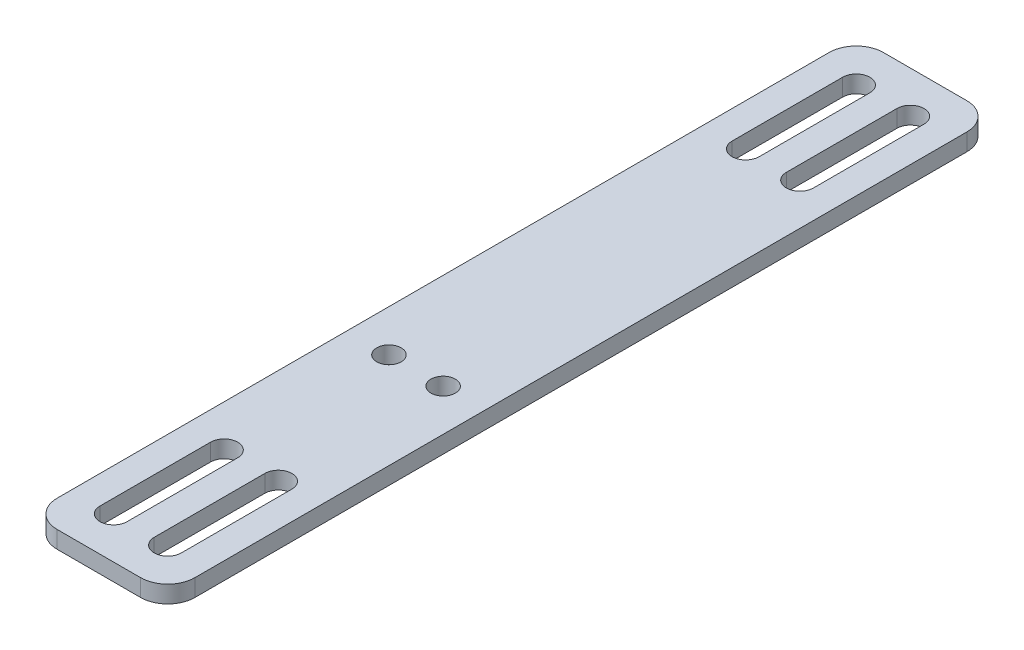
ISO-10303-21;
HEADER;
FILE_DESCRIPTION(('STEP AP214'),'2;1');
FILE_NAME('part.step','',(''),(''),'','','');
FILE_SCHEMA(('AUTOMOTIVE_DESIGN { 1 0 10303 214 1 1 1 1 }'));
ENDSEC;
DATA;
#1=APPLICATION_CONTEXT('core data for automotive mechanical design processes');
#2=APPLICATION_PROTOCOL_DEFINITION('international standard','automotive_design',2000,#1);
#3=PRODUCT_CONTEXT('',#1,'mechanical');
#4=PRODUCT('Part','Part','',(#3));
#5=PRODUCT_RELATED_PRODUCT_CATEGORY('part','',(#4));
#6=PRODUCT_DEFINITION_FORMATION('','',#4);
#7=PRODUCT_DEFINITION_CONTEXT('part definition',#1,'design');
#8=PRODUCT_DEFINITION('design','',#6,#7);
#9=PRODUCT_DEFINITION_SHAPE('','',#8);
#10=(LENGTH_UNIT() NAMED_UNIT(*) SI_UNIT(.MILLI.,.METRE.));
#11=(NAMED_UNIT(*) PLANE_ANGLE_UNIT() SI_UNIT($,.RADIAN.));
#12=(NAMED_UNIT(*) SI_UNIT($,.STERADIAN.) SOLID_ANGLE_UNIT());
#13=UNCERTAINTY_MEASURE_WITH_UNIT(LENGTH_MEASURE(1.E-05),#10,'distance_accuracy_value','');
#14=(GEOMETRIC_REPRESENTATION_CONTEXT(3) GLOBAL_UNCERTAINTY_ASSIGNED_CONTEXT((#13)) GLOBAL_UNIT_ASSIGNED_CONTEXT((#10,
#11,#12)) REPRESENTATION_CONTEXT('',''));
#15=CARTESIAN_POINT('',(0.,0.,0.));
#16=DIRECTION('',(0.,0.,1.));
#17=DIRECTION('',(1.,0.,0.));
#18=AXIS2_PLACEMENT_3D('',#15,#16,#17);
#19=CARTESIAN_POINT('',(12.7,-1.5875,76.2));
#20=DIRECTION('',(0.,1.,0.));
#21=DIRECTION('',(0.,0.,1.));
#22=AXIS2_PLACEMENT_3D('',#19,#20,#21);
#23=PLANE('',#22);
#24=CARTESIAN_POINT('',(5.,-1.5875,17.7));
#25=DIRECTION('',(0.,1.,0.));
#26=DIRECTION('',(0.,0.,1.));
#27=AXIS2_PLACEMENT_3D('',#24,#25,#26);
#28=CIRCLE('',#27,2.25);
#29=CARTESIAN_POINT('',(5.,-1.5875,19.95));
#30=VERTEX_POINT('',#29);
#31=EDGE_CURVE('E562',#30,#30,#28,.T.);
#32=ORIENTED_EDGE('',*,*,#31,.T.);
#33=EDGE_LOOP('',(#32));
#34=FACE_BOUND('',#33,.T.);
#35=CARTESIAN_POINT('',(-5.,-1.5875,17.7));
#36=DIRECTION('',(0.,1.,0.));
#37=DIRECTION('',(0.,0.,1.));
#38=AXIS2_PLACEMENT_3D('',#35,#36,#37);
#39=CIRCLE('',#38,2.25);
#40=CARTESIAN_POINT('',(-5.,-1.5875,19.95));
#41=VERTEX_POINT('',#40);
#42=EDGE_CURVE('E251',#41,#41,#39,.T.);
#43=ORIENTED_EDGE('',*,*,#42,.T.);
#44=EDGE_LOOP('',(#43));
#45=FACE_BOUND('',#44,.T.);
#46=CARTESIAN_POINT('',(-5.,-1.5875,-48.1));
#47=DIRECTION('',(0.,1.,0.));
#48=DIRECTION('',(0.,0.,1.));
#49=AXIS2_PLACEMENT_3D('',#46,#47,#48);
#50=CIRCLE('',#49,2.5);
#51=CARTESIAN_POINT('',(-7.5,-1.5875,-48.1));
#52=VERTEX_POINT('',#51);
#53=CARTESIAN_POINT('',(-2.5,-1.5875,-48.1));
#54=VERTEX_POINT('',#53);
#55=EDGE_CURVE('E247',#52,#54,#50,.T.);
#56=ORIENTED_EDGE('',*,*,#55,.T.);
#57=DIRECTION('',(0.,0.,-1.));
#58=VECTOR('',#57,1.);
#59=CARTESIAN_POINT('',(-2.5,-1.5875,-48.1));
#60=LINE('',#59,#58);
#61=CARTESIAN_POINT('',(-2.5,-1.5875,-68.5));
#62=VERTEX_POINT('',#61);
#63=EDGE_CURVE('E257',#54,#62,#60,.T.);
#64=ORIENTED_EDGE('',*,*,#63,.T.);
#65=CARTESIAN_POINT('',(-5.,-1.5875,-68.5));
#66=DIRECTION('',(0.,1.,0.));
#67=DIRECTION('',(0.,0.,1.));
#68=AXIS2_PLACEMENT_3D('',#65,#66,#67);
#69=CIRCLE('',#68,2.5);
#70=CARTESIAN_POINT('',(-7.50000000000001,-1.5875,-68.5));
#71=VERTEX_POINT('',#70);
#72=EDGE_CURVE('E254',#62,#71,#69,.T.);
#73=ORIENTED_EDGE('',*,*,#72,.T.);
#74=DIRECTION('',(0.,0.,-1.));
#75=VECTOR('',#74,1.);
#76=CARTESIAN_POINT('',(-7.5,-1.5875,-48.1));
#77=LINE('',#76,#75);
#78=EDGE_CURVE('E250',#52,#71,#77,.T.);
#79=ORIENTED_EDGE('',*,*,#78,.F.);
#80=EDGE_LOOP('',(#56,#64,#73,#79));
#81=FACE_BOUND('',#80,.T.);
#82=DIRECTION('',(0.,0.,1.));
#83=VECTOR('',#82,1.);
#84=CARTESIAN_POINT('',(7.5,-1.5875,48.1));
#85=LINE('',#84,#83);
#86=CARTESIAN_POINT('',(7.5,-1.5875,48.1));
#87=VERTEX_POINT('',#86);
#88=CARTESIAN_POINT('',(7.5,-1.5875,68.5));
#89=VERTEX_POINT('',#88);
#90=EDGE_CURVE('E281',#87,#89,#85,.T.);
#91=ORIENTED_EDGE('',*,*,#90,.F.);
#92=CARTESIAN_POINT('',(5.,-1.5875,48.1));
#93=DIRECTION('',(0.,-1.,0.));
#94=DIRECTION('',(0.,0.,-1.));
#95=AXIS2_PLACEMENT_3D('',#92,#93,#94);
#96=CIRCLE('',#95,2.5);
#97=CARTESIAN_POINT('',(2.5,-1.5875,48.1));
#98=VERTEX_POINT('',#97);
#99=EDGE_CURVE('E279',#98,#87,#96,.T.);
#100=ORIENTED_EDGE('',*,*,#99,.F.);
#101=DIRECTION('',(0.,0.,1.));
#102=VECTOR('',#101,1.);
#103=CARTESIAN_POINT('',(2.5,-1.5875,48.1));
#104=LINE('',#103,#102);
#105=CARTESIAN_POINT('',(2.5,-1.5875,68.5));
#106=VERTEX_POINT('',#105);
#107=EDGE_CURVE('E288',#98,#106,#104,.T.);
#108=ORIENTED_EDGE('',*,*,#107,.T.);
#109=CARTESIAN_POINT('',(5.,-1.5875,68.5));
#110=DIRECTION('',(0.,-1.,0.));
#111=DIRECTION('',(0.,0.,-1.));
#112=AXIS2_PLACEMENT_3D('',#109,#110,#111);
#113=CIRCLE('',#112,2.5);
#114=EDGE_CURVE('E285',#89,#106,#113,.T.);
#115=ORIENTED_EDGE('',*,*,#114,.F.);
#116=EDGE_LOOP('',(#91,#100,#108,#115));
#117=FACE_BOUND('',#116,.T.);
#118=DIRECTION('',(0.,0.,1.));
#119=VECTOR('',#118,1.);
#120=CARTESIAN_POINT('',(-2.5,-1.5875,48.1));
#121=LINE('',#120,#119);
#122=CARTESIAN_POINT('',(-2.5,-1.5875,48.1));
#123=VERTEX_POINT('',#122);
#124=CARTESIAN_POINT('',(-2.5,-1.5875,68.5));
#125=VERTEX_POINT('',#124);
#126=EDGE_CURVE('E319',#123,#125,#121,.T.);
#127=ORIENTED_EDGE('',*,*,#126,.F.);
#128=CARTESIAN_POINT('',(-5.,-1.5875,48.1));
#129=DIRECTION('',(0.,-1.,0.));
#130=DIRECTION('',(0.,0.,-1.));
#131=AXIS2_PLACEMENT_3D('',#128,#129,#130);
#132=CIRCLE('',#131,2.5);
#133=CARTESIAN_POINT('',(-7.5,-1.5875,48.1));
#134=VERTEX_POINT('',#133);
#135=EDGE_CURVE('E282',#134,#123,#132,.T.);
#136=ORIENTED_EDGE('',*,*,#135,.F.);
#137=DIRECTION('',(0.,0.,1.));
#138=VECTOR('',#137,1.);
#139=CARTESIAN_POINT('',(-7.5,-1.5875,48.1));
#140=LINE('',#139,#138);
#141=CARTESIAN_POINT('',(-7.50000000000001,-1.5875,68.5));
#142=VERTEX_POINT('',#141);
#143=EDGE_CURVE('E306',#134,#142,#140,.T.);
#144=ORIENTED_EDGE('',*,*,#143,.T.);
#145=CARTESIAN_POINT('',(-5.,-1.5875,68.5));
#146=DIRECTION('',(0.,-1.,0.));
#147=DIRECTION('',(0.,0.,-1.));
#148=AXIS2_PLACEMENT_3D('',#145,#146,#147);
#149=CIRCLE('',#148,2.5);
#150=EDGE_CURVE('E316',#125,#142,#149,.T.);
#151=ORIENTED_EDGE('',*,*,#150,.F.);
#152=EDGE_LOOP('',(#127,#136,#144,#151));
#153=FACE_BOUND('',#152,.T.);
#154=DIRECTION('',(1.,0.,0.));
#155=VECTOR('',#154,1.);
#156=CARTESIAN_POINT('',(12.7,-1.5875,76.2));
#157=LINE('',#156,#155);
#158=CARTESIAN_POINT('',(-7.7,-1.5875,76.2));
#159=VERTEX_POINT('',#158);
#160=CARTESIAN_POINT('',(7.7,-1.5875,76.2));
#161=VERTEX_POINT('',#160);
#162=EDGE_CURVE('E333',#159,#161,#157,.T.);
#163=ORIENTED_EDGE('',*,*,#162,.F.);
#164=CARTESIAN_POINT('',(-7.7,-1.5875,71.2));
#165=DIRECTION('',(0.,1.,0.));
#166=DIRECTION('',(0.,0.,1.));
#167=AXIS2_PLACEMENT_3D('',#164,#165,#166);
#168=CIRCLE('',#167,5.);
#169=CARTESIAN_POINT('',(-12.7,-1.5875,71.2));
#170=VERTEX_POINT('',#169);
#171=EDGE_CURVE('E362',#159,#170,#168,.F.);
#172=ORIENTED_EDGE('',*,*,#171,.T.);
#173=DIRECTION('',(0.,0.,-1.));
#174=VECTOR('',#173,1.);
#175=CARTESIAN_POINT('',(-12.7,-1.5875,76.2));
#176=LINE('',#175,#174);
#177=CARTESIAN_POINT('',(-12.7,-1.5875,-71.1999999999999));
#178=VERTEX_POINT('',#177);
#179=EDGE_CURVE('E347',#170,#178,#176,.T.);
#180=ORIENTED_EDGE('',*,*,#179,.T.);
#181=CARTESIAN_POINT('',(-7.7,-1.5875,-71.2));
#182=DIRECTION('',(0.,1.,0.));
#183=DIRECTION('',(0.,0.,1.));
#184=AXIS2_PLACEMENT_3D('',#181,#182,#183);
#185=CIRCLE('',#184,5.);
#186=CARTESIAN_POINT('',(-7.7,-1.5875,-76.2));
#187=VERTEX_POINT('',#186);
#188=EDGE_CURVE('E358',#178,#187,#185,.F.);
#189=ORIENTED_EDGE('',*,*,#188,.T.);
#190=DIRECTION('',(1.,0.,0.));
#191=VECTOR('',#190,1.);
#192=CARTESIAN_POINT('',(12.7,-1.5875,-76.2));
#193=LINE('',#192,#191);
#194=CARTESIAN_POINT('',(7.7,-1.5875,-76.2));
#195=VERTEX_POINT('',#194);
#196=EDGE_CURVE('E300',#187,#195,#193,.T.);
#197=ORIENTED_EDGE('',*,*,#196,.T.);
#198=CARTESIAN_POINT('',(7.7,-1.5875,-71.2));
#199=DIRECTION('',(0.,1.,0.));
#200=DIRECTION('',(0.,0.,1.));
#201=AXIS2_PLACEMENT_3D('',#198,#199,#200);
#202=CIRCLE('',#201,5.);
#203=CARTESIAN_POINT('',(12.7,-1.5875,-71.1999999999999));
#204=VERTEX_POINT('',#203);
#205=EDGE_CURVE('E356',#195,#204,#202,.F.);
#206=ORIENTED_EDGE('',*,*,#205,.T.);
#207=DIRECTION('',(0.,0.,-1.));
#208=VECTOR('',#207,1.);
#209=CARTESIAN_POINT('',(12.7,-1.5875,76.2));
#210=LINE('',#209,#208);
#211=CARTESIAN_POINT('',(12.7,-1.5875,71.2));
#212=VERTEX_POINT('',#211);
#213=EDGE_CURVE('E344',#212,#204,#210,.T.);
#214=ORIENTED_EDGE('',*,*,#213,.F.);
#215=CARTESIAN_POINT('',(7.7,-1.5875,71.2));
#216=DIRECTION('',(0.,1.,0.));
#217=DIRECTION('',(0.,0.,1.));
#218=AXIS2_PLACEMENT_3D('',#215,#216,#217);
#219=CIRCLE('',#218,5.);
#220=EDGE_CURVE('E360',#212,#161,#219,.F.);
#221=ORIENTED_EDGE('',*,*,#220,.T.);
#222=EDGE_LOOP('',(#163,#172,#180,#189,#197,#206,#214,#221));
#223=FACE_BOUND('',#222,.T.);
#224=CARTESIAN_POINT('',(5.,-1.5875,-48.1));
#225=DIRECTION('',(0.,1.,0.));
#226=DIRECTION('',(0.,0.,1.));
#227=AXIS2_PLACEMENT_3D('',#224,#225,#226);
#228=CIRCLE('',#227,2.5);
#229=CARTESIAN_POINT('',(2.5,-1.5875,-48.1));
#230=VERTEX_POINT('',#229);
#231=CARTESIAN_POINT('',(7.5,-1.5875,-48.1));
#232=VERTEX_POINT('',#231);
#233=EDGE_CURVE('E220',#230,#232,#228,.T.);
#234=ORIENTED_EDGE('',*,*,#233,.T.);
#235=DIRECTION('',(0.,0.,-1.));
#236=VECTOR('',#235,1.);
#237=CARTESIAN_POINT('',(7.5,-1.5875,-48.1));
#238=LINE('',#237,#236);
#239=CARTESIAN_POINT('',(7.5,-1.5875,-68.5));
#240=VERTEX_POINT('',#239);
#241=EDGE_CURVE('E223',#232,#240,#238,.T.);
#242=ORIENTED_EDGE('',*,*,#241,.T.);
#243=CARTESIAN_POINT('',(5.,-1.5875,-68.5));
#244=DIRECTION('',(0.,1.,0.));
#245=DIRECTION('',(0.,0.,1.));
#246=AXIS2_PLACEMENT_3D('',#243,#244,#245);
#247=CIRCLE('',#246,2.5);
#248=CARTESIAN_POINT('',(2.5,-1.5875,-68.5));
#249=VERTEX_POINT('',#248);
#250=EDGE_CURVE('E204',#240,#249,#247,.T.);
#251=ORIENTED_EDGE('',*,*,#250,.T.);
#252=DIRECTION('',(0.,0.,-1.));
#253=VECTOR('',#252,1.);
#254=CARTESIAN_POINT('',(2.5,-1.5875,-48.1));
#255=LINE('',#254,#253);
#256=EDGE_CURVE('E215',#230,#249,#255,.T.);
#257=ORIENTED_EDGE('',*,*,#256,.F.);
#258=EDGE_LOOP('',(#234,#242,#251,#257));
#259=FACE_BOUND('',#258,.T.);
#260=ADVANCED_FACE('F39',(#34,#45,#81,#117,#153,#223,#259),#23,.F.);
#261=CARTESIAN_POINT('',(12.7,1.5875,76.2));
#262=DIRECTION('',(0.,-1.,0.));
#263=DIRECTION('',(0.,0.,-1.));
#264=AXIS2_PLACEMENT_3D('',#261,#262,#263);
#265=PLANE('',#264);
#266=CARTESIAN_POINT('',(5.,1.5875,17.7));
#267=DIRECTION('',(0.,1.,0.));
#268=DIRECTION('',(0.,0.,1.));
#269=AXIS2_PLACEMENT_3D('',#266,#267,#268);
#270=CIRCLE('',#269,2.25);
#271=CARTESIAN_POINT('',(5.,1.5875,19.95));
#272=VERTEX_POINT('',#271);
#273=EDGE_CURVE('E564',#272,#272,#270,.T.);
#274=ORIENTED_EDGE('',*,*,#273,.F.);
#275=EDGE_LOOP('',(#274));
#276=FACE_BOUND('',#275,.T.);
#277=CARTESIAN_POINT('',(-5.,1.5875,17.7));
#278=DIRECTION('',(0.,1.,0.));
#279=DIRECTION('',(0.,0.,1.));
#280=AXIS2_PLACEMENT_3D('',#277,#278,#279);
#281=CIRCLE('',#280,2.25);
#282=CARTESIAN_POINT('',(-5.,1.5875,19.95));
#283=VERTEX_POINT('',#282);
#284=EDGE_CURVE('E559',#283,#283,#281,.T.);
#285=ORIENTED_EDGE('',*,*,#284,.F.);
#286=EDGE_LOOP('',(#285));
#287=FACE_BOUND('',#286,.T.);
#288=CARTESIAN_POINT('',(-5.,1.5875,-48.1));
#289=DIRECTION('',(0.,-1.,0.));
#290=DIRECTION('',(0.,0.,-1.));
#291=AXIS2_PLACEMENT_3D('',#288,#289,#290);
#292=CIRCLE('',#291,2.5);
#293=CARTESIAN_POINT('',(-2.5,1.5875,-48.1));
#294=VERTEX_POINT('',#293);
#295=CARTESIAN_POINT('',(-7.5,1.5875,-48.1));
#296=VERTEX_POINT('',#295);
#297=EDGE_CURVE('E243',#294,#296,#292,.T.);
#298=ORIENTED_EDGE('',*,*,#297,.T.);
#299=DIRECTION('',(0.,0.,1.));
#300=VECTOR('',#299,1.);
#301=CARTESIAN_POINT('',(-7.5,1.5875,-48.1));
#302=LINE('',#301,#300);
#303=CARTESIAN_POINT('',(-7.5,1.5875,-68.5));
#304=VERTEX_POINT('',#303);
#305=EDGE_CURVE('E246',#304,#296,#302,.T.);
#306=ORIENTED_EDGE('',*,*,#305,.F.);
#307=CARTESIAN_POINT('',(-5.,1.5875,-68.5));
#308=DIRECTION('',(0.,-1.,0.));
#309=DIRECTION('',(0.,0.,-1.));
#310=AXIS2_PLACEMENT_3D('',#307,#308,#309);
#311=CIRCLE('',#310,2.5);
#312=CARTESIAN_POINT('',(-2.5,1.5875,-68.5));
#313=VERTEX_POINT('',#312);
#314=EDGE_CURVE('E236',#304,#313,#311,.T.);
#315=ORIENTED_EDGE('',*,*,#314,.T.);
#316=DIRECTION('',(0.,0.,1.));
#317=VECTOR('',#316,1.);
#318=CARTESIAN_POINT('',(-2.5,1.5875,-48.1));
#319=LINE('',#318,#317);
#320=EDGE_CURVE('E239',#313,#294,#319,.T.);
#321=ORIENTED_EDGE('',*,*,#320,.T.);
#322=EDGE_LOOP('',(#298,#306,#315,#321));
#323=FACE_BOUND('',#322,.T.);
#324=DIRECTION('',(0.,0.,-1.));
#325=VECTOR('',#324,1.);
#326=CARTESIAN_POINT('',(2.5,1.5875,48.1));
#327=LINE('',#326,#325);
#328=CARTESIAN_POINT('',(2.5,1.5875,68.5));
#329=VERTEX_POINT('',#328);
#330=CARTESIAN_POINT('',(2.5,1.5875,48.1));
#331=VERTEX_POINT('',#330);
#332=EDGE_CURVE('E272',#329,#331,#327,.T.);
#333=ORIENTED_EDGE('',*,*,#332,.T.);
#334=CARTESIAN_POINT('',(5.,1.5875,48.1));
#335=DIRECTION('',(0.,-1.,0.));
#336=DIRECTION('',(0.,0.,-1.));
#337=AXIS2_PLACEMENT_3D('',#334,#335,#336);
#338=CIRCLE('',#337,2.5);
#339=CARTESIAN_POINT('',(7.5,1.5875,48.1));
#340=VERTEX_POINT('',#339);
#341=EDGE_CURVE('E276',#340,#331,#338,.F.);
#342=ORIENTED_EDGE('',*,*,#341,.F.);
#343=DIRECTION('',(0.,0.,-1.));
#344=VECTOR('',#343,1.);
#345=CARTESIAN_POINT('',(7.5,1.5875,48.1));
#346=LINE('',#345,#344);
#347=CARTESIAN_POINT('',(7.5,1.5875,68.5));
#348=VERTEX_POINT('',#347);
#349=EDGE_CURVE('E278',#348,#340,#346,.T.);
#350=ORIENTED_EDGE('',*,*,#349,.F.);
#351=CARTESIAN_POINT('',(5.,1.5875,68.5));
#352=DIRECTION('',(0.,-1.,0.));
#353=DIRECTION('',(0.,0.,-1.));
#354=AXIS2_PLACEMENT_3D('',#351,#352,#353);
#355=CIRCLE('',#354,2.5);
#356=EDGE_CURVE('E269',#329,#348,#355,.F.);
#357=ORIENTED_EDGE('',*,*,#356,.F.);
#358=EDGE_LOOP('',(#333,#342,#350,#357));
#359=FACE_BOUND('',#358,.T.);
#360=DIRECTION('',(0.,0.,-1.));
#361=VECTOR('',#360,1.);
#362=CARTESIAN_POINT('',(-7.5,1.5875,48.1));
#363=LINE('',#362,#361);
#364=CARTESIAN_POINT('',(-7.50000000000001,1.5875,68.5));
#365=VERTEX_POINT('',#364);
#366=CARTESIAN_POINT('',(-7.5,1.5875,48.1));
#367=VERTEX_POINT('',#366);
#368=EDGE_CURVE('E324',#365,#367,#363,.T.);
#369=ORIENTED_EDGE('',*,*,#368,.T.);
#370=CARTESIAN_POINT('',(-5.,1.5875,48.1));
#371=DIRECTION('',(0.,-1.,0.));
#372=DIRECTION('',(0.,0.,-1.));
#373=AXIS2_PLACEMENT_3D('',#370,#371,#372);
#374=CIRCLE('',#373,2.5);
#375=CARTESIAN_POINT('',(-2.5,1.5875,48.1));
#376=VERTEX_POINT('',#375);
#377=EDGE_CURVE('E302',#376,#367,#374,.F.);
#378=ORIENTED_EDGE('',*,*,#377,.F.);
#379=DIRECTION('',(0.,0.,-1.));
#380=VECTOR('',#379,1.);
#381=CARTESIAN_POINT('',(-2.5,1.5875,48.1));
#382=LINE('',#381,#380);
#383=CARTESIAN_POINT('',(-2.5,1.5875,68.5));
#384=VERTEX_POINT('',#383);
#385=EDGE_CURVE('E234',#384,#376,#382,.T.);
#386=ORIENTED_EDGE('',*,*,#385,.F.);
#387=CARTESIAN_POINT('',(-5.,1.5875,68.5));
#388=DIRECTION('',(0.,-1.,0.));
#389=DIRECTION('',(0.,0.,-1.));
#390=AXIS2_PLACEMENT_3D('',#387,#388,#389);
#391=CIRCLE('',#390,2.5);
#392=EDGE_CURVE('E313',#365,#384,#391,.F.);
#393=ORIENTED_EDGE('',*,*,#392,.F.);
#394=EDGE_LOOP('',(#369,#378,#386,#393));
#395=FACE_BOUND('',#394,.T.);
#396=DIRECTION('',(0.,0.,-1.));
#397=VECTOR('',#396,1.);
#398=CARTESIAN_POINT('',(-12.7,1.5875,76.2));
#399=LINE('',#398,#397);
#400=CARTESIAN_POINT('',(-12.7,1.5875,71.2));
#401=VERTEX_POINT('',#400);
#402=CARTESIAN_POINT('',(-12.7,1.5875,-71.1999999999999));
#403=VERTEX_POINT('',#402);
#404=EDGE_CURVE('E339',#401,#403,#399,.T.);
#405=ORIENTED_EDGE('',*,*,#404,.F.);
#406=CARTESIAN_POINT('',(-7.7,1.5875,71.2));
#407=DIRECTION('',(0.,-1.,0.));
#408=DIRECTION('',(0.,0.,-1.));
#409=AXIS2_PLACEMENT_3D('',#406,#407,#408);
#410=CIRCLE('',#409,5.);
#411=CARTESIAN_POINT('',(-7.7,1.5875,76.2));
#412=VERTEX_POINT('',#411);
#413=EDGE_CURVE('E374',#401,#412,#410,.F.);
#414=ORIENTED_EDGE('',*,*,#413,.T.);
#415=DIRECTION('',(-1.,0.,0.));
#416=VECTOR('',#415,1.);
#417=CARTESIAN_POINT('',(12.7,1.5875,76.2));
#418=LINE('',#417,#416);
#419=CARTESIAN_POINT('',(7.7,1.5875,76.2));
#420=VERTEX_POINT('',#419);
#421=EDGE_CURVE('E336',#420,#412,#418,.T.);
#422=ORIENTED_EDGE('',*,*,#421,.F.);
#423=CARTESIAN_POINT('',(7.7,1.5875,71.2));
#424=DIRECTION('',(0.,-1.,0.));
#425=DIRECTION('',(0.,0.,-1.));
#426=AXIS2_PLACEMENT_3D('',#423,#424,#425);
#427=CIRCLE('',#426,5.);
#428=CARTESIAN_POINT('',(12.7,1.5875,71.2));
#429=VERTEX_POINT('',#428);
#430=EDGE_CURVE('E372',#420,#429,#427,.F.);
#431=ORIENTED_EDGE('',*,*,#430,.T.);
#432=DIRECTION('',(0.,0.,-1.));
#433=VECTOR('',#432,1.);
#434=CARTESIAN_POINT('',(12.7,1.5875,76.2));
#435=LINE('',#434,#433);
#436=CARTESIAN_POINT('',(12.7,1.5875,-71.1999999999999));
#437=VERTEX_POINT('',#436);
#438=EDGE_CURVE('E342',#429,#437,#435,.T.);
#439=ORIENTED_EDGE('',*,*,#438,.T.);
#440=CARTESIAN_POINT('',(7.7,1.5875,-71.2));
#441=DIRECTION('',(0.,-1.,0.));
#442=DIRECTION('',(0.,0.,-1.));
#443=AXIS2_PLACEMENT_3D('',#440,#441,#442);
#444=CIRCLE('',#443,5.);
#445=CARTESIAN_POINT('',(7.7,1.5875,-76.2));
#446=VERTEX_POINT('',#445);
#447=EDGE_CURVE('E59',#437,#446,#444,.F.);
#448=ORIENTED_EDGE('',*,*,#447,.T.);
#449=DIRECTION('',(-1.,0.,0.));
#450=VECTOR('',#449,1.);
#451=CARTESIAN_POINT('',(12.7,1.5875,-76.2));
#452=LINE('',#451,#450);
#453=CARTESIAN_POINT('',(-7.7,1.5875,-76.2));
#454=VERTEX_POINT('',#453);
#455=EDGE_CURVE('E331',#446,#454,#452,.T.);
#456=ORIENTED_EDGE('',*,*,#455,.T.);
#457=CARTESIAN_POINT('',(-7.7,1.5875,-71.2));
#458=DIRECTION('',(0.,-1.,0.));
#459=DIRECTION('',(0.,0.,-1.));
#460=AXIS2_PLACEMENT_3D('',#457,#458,#459);
#461=CIRCLE('',#460,5.);
#462=EDGE_CURVE('E370',#454,#403,#461,.F.);
#463=ORIENTED_EDGE('',*,*,#462,.T.);
#464=EDGE_LOOP('',(#405,#414,#422,#431,#439,#448,#456,#463));
#465=FACE_BOUND('',#464,.T.);
#466=CARTESIAN_POINT('',(5.,1.5875,-48.1));
#467=DIRECTION('',(0.,-1.,0.));
#468=DIRECTION('',(0.,0.,-1.));
#469=AXIS2_PLACEMENT_3D('',#466,#467,#468);
#470=CIRCLE('',#469,2.5);
#471=CARTESIAN_POINT('',(7.5,1.5875,-48.1));
#472=VERTEX_POINT('',#471);
#473=CARTESIAN_POINT('',(2.5,1.5875,-48.1));
#474=VERTEX_POINT('',#473);
#475=EDGE_CURVE('E235',#472,#474,#470,.T.);
#476=ORIENTED_EDGE('',*,*,#475,.T.);
#477=DIRECTION('',(0.,0.,1.));
#478=VECTOR('',#477,1.);
#479=CARTESIAN_POINT('',(2.5,1.5875,-48.1));
#480=LINE('',#479,#478);
#481=CARTESIAN_POINT('',(2.5,1.5875,-68.5));
#482=VERTEX_POINT('',#481);
#483=EDGE_CURVE('E232',#482,#474,#480,.T.);
#484=ORIENTED_EDGE('',*,*,#483,.F.);
#485=CARTESIAN_POINT('',(5.,1.5875,-68.5));
#486=DIRECTION('',(0.,-1.,0.));
#487=DIRECTION('',(0.,0.,-1.));
#488=AXIS2_PLACEMENT_3D('',#485,#486,#487);
#489=CIRCLE('',#488,2.5);
#490=CARTESIAN_POINT('',(7.5,1.5875,-68.5));
#491=VERTEX_POINT('',#490);
#492=EDGE_CURVE('E207',#482,#491,#489,.T.);
#493=ORIENTED_EDGE('',*,*,#492,.T.);
#494=DIRECTION('',(0.,0.,1.));
#495=VECTOR('',#494,1.);
#496=CARTESIAN_POINT('',(7.5,1.5875,-48.1));
#497=LINE('',#496,#495);
#498=EDGE_CURVE('E551',#491,#472,#497,.T.);
#499=ORIENTED_EDGE('',*,*,#498,.T.);
#500=EDGE_LOOP('',(#476,#484,#493,#499));
#501=FACE_BOUND('',#500,.T.);
#502=ADVANCED_FACE('F393',(#276,#287,#323,#359,#395,#465,#501),#265,.F.);
#503=CARTESIAN_POINT('',(-12.7,1.5875,76.2));
#504=DIRECTION('',(1.,0.,0.));
#505=DIRECTION('',(0.,0.,-1.));
#506=AXIS2_PLACEMENT_3D('',#503,#504,#505);
#507=PLANE('',#506);
#508=ORIENTED_EDGE('',*,*,#179,.F.);
#509=DIRECTION('',(0.,-1.,0.));
#510=VECTOR('',#509,1.);
#511=CARTESIAN_POINT('',(-12.7,1.5875,71.2));
#512=LINE('',#511,#510);
#513=EDGE_CURVE('E367',#170,#401,#512,.F.);
#514=ORIENTED_EDGE('',*,*,#513,.T.);
#515=ORIENTED_EDGE('',*,*,#404,.T.);
#516=DIRECTION('',(0.,-1.,0.));
#517=VECTOR('',#516,1.);
#518=CARTESIAN_POINT('',(-12.7,-1.5875,-71.2));
#519=LINE('',#518,#517);
#520=EDGE_CURVE('E364',#403,#178,#519,.T.);
#521=ORIENTED_EDGE('',*,*,#520,.T.);
#522=EDGE_LOOP('',(#508,#514,#515,#521));
#523=FACE_BOUND('',#522,.T.);
#524=ADVANCED_FACE('F407',(#523),#507,.F.);
#525=CARTESIAN_POINT('',(12.7,1.5875,76.2));
#526=DIRECTION('',(-1.,0.,0.));
#527=DIRECTION('',(0.,0.,1.));
#528=AXIS2_PLACEMENT_3D('',#525,#526,#527);
#529=PLANE('',#528);
#530=ORIENTED_EDGE('',*,*,#438,.F.);
#531=DIRECTION('',(0.,1.,0.));
#532=VECTOR('',#531,1.);
#533=CARTESIAN_POINT('',(12.7,1.5875,71.2));
#534=LINE('',#533,#532);
#535=EDGE_CURVE('E379',#429,#212,#534,.F.);
#536=ORIENTED_EDGE('',*,*,#535,.T.);
#537=ORIENTED_EDGE('',*,*,#213,.T.);
#538=DIRECTION('',(0.,1.,0.));
#539=VECTOR('',#538,1.);
#540=CARTESIAN_POINT('',(12.7,1.5875,-71.2));
#541=LINE('',#540,#539);
#542=EDGE_CURVE('E376',#204,#437,#541,.T.);
#543=ORIENTED_EDGE('',*,*,#542,.T.);
#544=EDGE_LOOP('',(#530,#536,#537,#543));
#545=FACE_BOUND('',#544,.T.);
#546=ADVANCED_FACE('F390',(#545),#529,.F.);
#547=CARTESIAN_POINT('',(0.,0.,76.2));
#548=DIRECTION('',(0.,0.,-1.));
#549=DIRECTION('',(-1.,0.,0.));
#550=AXIS2_PLACEMENT_3D('',#547,#548,#549);
#551=PLANE('',#550);
#552=ORIENTED_EDGE('',*,*,#421,.T.);
#553=DIRECTION('',(0.,-1.,0.));
#554=VECTOR('',#553,1.);
#555=CARTESIAN_POINT('',(-7.7,0.,76.2));
#556=LINE('',#555,#554);
#557=EDGE_CURVE('E353',#412,#159,#556,.T.);
#558=ORIENTED_EDGE('',*,*,#557,.T.);
#559=ORIENTED_EDGE('',*,*,#162,.T.);
#560=DIRECTION('',(0.,1.,0.));
#561=VECTOR('',#560,1.);
#562=CARTESIAN_POINT('',(7.7,0.,76.2));
#563=LINE('',#562,#561);
#564=EDGE_CURVE('E350',#161,#420,#563,.T.);
#565=ORIENTED_EDGE('',*,*,#564,.T.);
#566=EDGE_LOOP('',(#552,#558,#559,#565));
#567=FACE_BOUND('',#566,.T.);
#568=ADVANCED_FACE('F401',(#567),#551,.F.);
#569=CARTESIAN_POINT('',(0.,0.,-76.2));
#570=DIRECTION('',(0.,0.,-1.));
#571=DIRECTION('',(-1.,0.,0.));
#572=AXIS2_PLACEMENT_3D('',#569,#570,#571);
#573=PLANE('',#572);
#574=ORIENTED_EDGE('',*,*,#196,.F.);
#575=DIRECTION('',(0.,-1.,0.));
#576=VECTOR('',#575,1.);
#577=CARTESIAN_POINT('',(-7.7,1.5875,-76.2));
#578=LINE('',#577,#576);
#579=EDGE_CURVE('E11',#187,#454,#578,.F.);
#580=ORIENTED_EDGE('',*,*,#579,.T.);
#581=ORIENTED_EDGE('',*,*,#455,.F.);
#582=DIRECTION('',(0.,1.,0.));
#583=VECTOR('',#582,1.);
#584=CARTESIAN_POINT('',(7.7,-1.5875,-76.2));
#585=LINE('',#584,#583);
#586=EDGE_CURVE('E47',#446,#195,#585,.F.);
#587=ORIENTED_EDGE('',*,*,#586,.T.);
#588=EDGE_LOOP('',(#574,#580,#581,#587));
#589=FACE_BOUND('',#588,.T.);
#590=ADVANCED_FACE('F381',(#589),#573,.T.);
#591=CARTESIAN_POINT('',(-5.,27.4749486962312,48.1));
#592=DIRECTION('',(0.,-1.,0.));
#593=DIRECTION('',(0.,0.,-1.));
#594=AXIS2_PLACEMENT_3D('',#591,#592,#593);
#595=CYLINDRICAL_SURFACE('',#594,2.5);
#596=ORIENTED_EDGE('',*,*,#377,.T.);
#597=DIRECTION('',(0.,-1.,0.));
#598=VECTOR('',#597,1.);
#599=CARTESIAN_POINT('',(-7.5,27.4749486962312,48.1));
#600=LINE('',#599,#598);
#601=EDGE_CURVE('E311',#367,#134,#600,.T.);
#602=ORIENTED_EDGE('',*,*,#601,.T.);
#603=ORIENTED_EDGE('',*,*,#135,.T.);
#604=DIRECTION('',(0.,-1.,0.));
#605=VECTOR('',#604,1.);
#606=CARTESIAN_POINT('',(-2.5,27.4749486962312,48.1));
#607=LINE('',#606,#605);
#608=EDGE_CURVE('E303',#376,#123,#607,.T.);
#609=ORIENTED_EDGE('',*,*,#608,.F.);
#610=EDGE_LOOP('',(#596,#602,#603,#609));
#611=FACE_BOUND('',#610,.T.);
#612=ADVANCED_FACE('F484',(#611),#595,.F.);
#613=CARTESIAN_POINT('',(-7.5,27.4749486962312,48.1));
#614=DIRECTION('',(1.,0.,0.));
#615=DIRECTION('',(0.,0.,-1.));
#616=AXIS2_PLACEMENT_3D('',#613,#614,#615);
#617=PLANE('',#616);
#618=DIRECTION('',(0.,-1.,0.));
#619=VECTOR('',#618,1.);
#620=CARTESIAN_POINT('',(-7.50000000000001,27.4749486962312,68.5));
#621=LINE('',#620,#619);
#622=EDGE_CURVE('E309',#365,#142,#621,.T.);
#623=ORIENTED_EDGE('',*,*,#622,.T.);
#624=ORIENTED_EDGE('',*,*,#143,.F.);
#625=ORIENTED_EDGE('',*,*,#601,.F.);
#626=ORIENTED_EDGE('',*,*,#368,.F.);
#627=EDGE_LOOP('',(#623,#624,#625,#626));
#628=FACE_BOUND('',#627,.T.);
#629=ADVANCED_FACE('F487',(#628),#617,.T.);
#630=CARTESIAN_POINT('',(-5.,27.4749486962312,68.5));
#631=DIRECTION('',(0.,-1.,0.));
#632=DIRECTION('',(0.,0.,-1.));
#633=AXIS2_PLACEMENT_3D('',#630,#631,#632);
#634=CYLINDRICAL_SURFACE('',#633,2.5);
#635=ORIENTED_EDGE('',*,*,#392,.T.);
#636=DIRECTION('',(0.,-1.,0.));
#637=VECTOR('',#636,1.);
#638=CARTESIAN_POINT('',(-2.5,27.4749486962312,68.5));
#639=LINE('',#638,#637);
#640=EDGE_CURVE('E307',#384,#125,#639,.T.);
#641=ORIENTED_EDGE('',*,*,#640,.T.);
#642=ORIENTED_EDGE('',*,*,#150,.T.);
#643=ORIENTED_EDGE('',*,*,#622,.F.);
#644=EDGE_LOOP('',(#635,#641,#642,#643));
#645=FACE_BOUND('',#644,.T.);
#646=ADVANCED_FACE('F491',(#645),#634,.F.);
#647=CARTESIAN_POINT('',(-2.5,27.4749486962312,48.1));
#648=DIRECTION('',(1.,0.,0.));
#649=DIRECTION('',(0.,0.,-1.));
#650=AXIS2_PLACEMENT_3D('',#647,#648,#649);
#651=PLANE('',#650);
#652=ORIENTED_EDGE('',*,*,#385,.T.);
#653=ORIENTED_EDGE('',*,*,#608,.T.);
#654=ORIENTED_EDGE('',*,*,#126,.T.);
#655=ORIENTED_EDGE('',*,*,#640,.F.);
#656=EDGE_LOOP('',(#652,#653,#654,#655));
#657=FACE_BOUND('',#656,.T.);
#658=ADVANCED_FACE('F482',(#657),#651,.F.);
#659=CARTESIAN_POINT('',(5.,27.4749486962312,48.1));
#660=DIRECTION('',(0.,-1.,0.));
#661=DIRECTION('',(0.,0.,-1.));
#662=AXIS2_PLACEMENT_3D('',#659,#660,#661);
#663=CYLINDRICAL_SURFACE('',#662,2.5);
#664=ORIENTED_EDGE('',*,*,#341,.T.);
#665=DIRECTION('',(0.,-1.,0.));
#666=VECTOR('',#665,1.);
#667=CARTESIAN_POINT('',(2.5,27.4749486962312,48.1));
#668=LINE('',#667,#666);
#669=EDGE_CURVE('E273',#331,#98,#668,.T.);
#670=ORIENTED_EDGE('',*,*,#669,.T.);
#671=ORIENTED_EDGE('',*,*,#99,.T.);
#672=DIRECTION('',(0.,-1.,0.));
#673=VECTOR('',#672,1.);
#674=CARTESIAN_POINT('',(7.5,27.4749486962312,48.1));
#675=LINE('',#674,#673);
#676=EDGE_CURVE('E291',#340,#87,#675,.T.);
#677=ORIENTED_EDGE('',*,*,#676,.F.);
#678=EDGE_LOOP('',(#664,#670,#671,#677));
#679=FACE_BOUND('',#678,.T.);
#680=ADVANCED_FACE('F472',(#679),#663,.F.);
#681=CARTESIAN_POINT('',(2.5,27.4749486962312,48.1));
#682=DIRECTION('',(1.,0.,0.));
#683=DIRECTION('',(0.,0.,-1.));
#684=AXIS2_PLACEMENT_3D('',#681,#682,#683);
#685=PLANE('',#684);
#686=DIRECTION('',(0.,-1.,0.));
#687=VECTOR('',#686,1.);
#688=CARTESIAN_POINT('',(2.5,27.4749486962312,68.5));
#689=LINE('',#688,#687);
#690=EDGE_CURVE('E293',#329,#106,#689,.T.);
#691=ORIENTED_EDGE('',*,*,#690,.T.);
#692=ORIENTED_EDGE('',*,*,#107,.F.);
#693=ORIENTED_EDGE('',*,*,#669,.F.);
#694=ORIENTED_EDGE('',*,*,#332,.F.);
#695=EDGE_LOOP('',(#691,#692,#693,#694));
#696=FACE_BOUND('',#695,.T.);
#697=ADVANCED_FACE('F468',(#696),#685,.T.);
#698=CARTESIAN_POINT('',(5.,27.4749486962312,68.5));
#699=DIRECTION('',(0.,-1.,0.));
#700=DIRECTION('',(0.,0.,-1.));
#701=AXIS2_PLACEMENT_3D('',#698,#699,#700);
#702=CYLINDRICAL_SURFACE('',#701,2.5);
#703=ORIENTED_EDGE('',*,*,#356,.T.);
#704=DIRECTION('',(0.,-1.,0.));
#705=VECTOR('',#704,1.);
#706=CARTESIAN_POINT('',(7.5,27.4749486962312,68.5));
#707=LINE('',#706,#705);
#708=EDGE_CURVE('E295',#348,#89,#707,.T.);
#709=ORIENTED_EDGE('',*,*,#708,.T.);
#710=ORIENTED_EDGE('',*,*,#114,.T.);
#711=ORIENTED_EDGE('',*,*,#690,.F.);
#712=EDGE_LOOP('',(#703,#709,#710,#711));
#713=FACE_BOUND('',#712,.T.);
#714=ADVANCED_FACE('F471',(#713),#702,.F.);
#715=CARTESIAN_POINT('',(7.5,27.4749486962312,48.1));
#716=DIRECTION('',(1.,0.,0.));
#717=DIRECTION('',(0.,0.,-1.));
#718=AXIS2_PLACEMENT_3D('',#715,#716,#717);
#719=PLANE('',#718);
#720=ORIENTED_EDGE('',*,*,#349,.T.);
#721=ORIENTED_EDGE('',*,*,#676,.T.);
#722=ORIENTED_EDGE('',*,*,#90,.T.);
#723=ORIENTED_EDGE('',*,*,#708,.F.);
#724=EDGE_LOOP('',(#720,#721,#722,#723));
#725=FACE_BOUND('',#724,.T.);
#726=ADVANCED_FACE('F466',(#725),#719,.F.);
#727=CARTESIAN_POINT('',(-5.,27.4749486962312,-48.1));
#728=DIRECTION('',(0.,-1.,0.));
#729=DIRECTION('',(0.,0.,-1.));
#730=AXIS2_PLACEMENT_3D('',#727,#728,#729);
#731=CYLINDRICAL_SURFACE('',#730,2.5);
#732=DIRECTION('',(0.,-1.,0.));
#733=VECTOR('',#732,1.);
#734=CARTESIAN_POINT('',(-2.5,27.4749486962312,-48.1));
#735=LINE('',#734,#733);
#736=EDGE_CURVE('E240',#294,#54,#735,.T.);
#737=ORIENTED_EDGE('',*,*,#736,.T.);
#738=ORIENTED_EDGE('',*,*,#55,.F.);
#739=DIRECTION('',(0.,-1.,0.));
#740=VECTOR('',#739,1.);
#741=CARTESIAN_POINT('',(-7.5,27.4749486962312,-48.1));
#742=LINE('',#741,#740);
#743=EDGE_CURVE('E260',#296,#52,#742,.T.);
#744=ORIENTED_EDGE('',*,*,#743,.F.);
#745=ORIENTED_EDGE('',*,*,#297,.F.);
#746=EDGE_LOOP('',(#737,#738,#744,#745));
#747=FACE_BOUND('',#746,.T.);
#748=ADVANCED_FACE('F456',(#747),#731,.F.);
#749=CARTESIAN_POINT('',(-2.5,27.4749486962312,-48.1));
#750=DIRECTION('',(-1.,0.,0.));
#751=DIRECTION('',(0.,0.,1.));
#752=AXIS2_PLACEMENT_3D('',#749,#750,#751);
#753=PLANE('',#752);
#754=DIRECTION('',(0.,-1.,0.));
#755=VECTOR('',#754,1.);
#756=CARTESIAN_POINT('',(-2.5,27.4749486962312,-68.5));
#757=LINE('',#756,#755);
#758=EDGE_CURVE('E262',#313,#62,#757,.T.);
#759=ORIENTED_EDGE('',*,*,#758,.T.);
#760=ORIENTED_EDGE('',*,*,#63,.F.);
#761=ORIENTED_EDGE('',*,*,#736,.F.);
#762=ORIENTED_EDGE('',*,*,#320,.F.);
#763=EDGE_LOOP('',(#759,#760,#761,#762));
#764=FACE_BOUND('',#763,.T.);
#765=ADVANCED_FACE('F452',(#764),#753,.T.);
#766=CARTESIAN_POINT('',(-5.,27.4749486962312,-68.5));
#767=DIRECTION('',(0.,-1.,0.));
#768=DIRECTION('',(0.,0.,-1.));
#769=AXIS2_PLACEMENT_3D('',#766,#767,#768);
#770=CYLINDRICAL_SURFACE('',#769,2.5);
#771=DIRECTION('',(0.,-1.,0.));
#772=VECTOR('',#771,1.);
#773=CARTESIAN_POINT('',(-7.50000000000001,27.4749486962312,-68.5));
#774=LINE('',#773,#772);
#775=EDGE_CURVE('E264',#304,#71,#774,.T.);
#776=ORIENTED_EDGE('',*,*,#775,.T.);
#777=ORIENTED_EDGE('',*,*,#72,.F.);
#778=ORIENTED_EDGE('',*,*,#758,.F.);
#779=ORIENTED_EDGE('',*,*,#314,.F.);
#780=EDGE_LOOP('',(#776,#777,#778,#779));
#781=FACE_BOUND('',#780,.T.);
#782=ADVANCED_FACE('F455',(#781),#770,.F.);
#783=CARTESIAN_POINT('',(-7.5,27.4749486962312,-48.1));
#784=DIRECTION('',(-1.,0.,0.));
#785=DIRECTION('',(0.,0.,1.));
#786=AXIS2_PLACEMENT_3D('',#783,#784,#785);
#787=PLANE('',#786);
#788=ORIENTED_EDGE('',*,*,#305,.T.);
#789=ORIENTED_EDGE('',*,*,#743,.T.);
#790=ORIENTED_EDGE('',*,*,#78,.T.);
#791=ORIENTED_EDGE('',*,*,#775,.F.);
#792=EDGE_LOOP('',(#788,#789,#790,#791));
#793=FACE_BOUND('',#792,.T.);
#794=ADVANCED_FACE('F450',(#793),#787,.F.);
#795=CARTESIAN_POINT('',(5.,27.4749486962312,-48.1));
#796=DIRECTION('',(0.,-1.,0.));
#797=DIRECTION('',(0.,0.,-1.));
#798=AXIS2_PLACEMENT_3D('',#795,#796,#797);
#799=CYLINDRICAL_SURFACE('',#798,2.5);
#800=DIRECTION('',(0.,-1.,0.));
#801=VECTOR('',#800,1.);
#802=CARTESIAN_POINT('',(7.5,27.4749486962312,-48.1));
#803=LINE('',#802,#801);
#804=EDGE_CURVE('E228',#472,#232,#803,.T.);
#805=ORIENTED_EDGE('',*,*,#804,.T.);
#806=ORIENTED_EDGE('',*,*,#233,.F.);
#807=DIRECTION('',(0.,-1.,0.));
#808=VECTOR('',#807,1.);
#809=CARTESIAN_POINT('',(2.5,27.4749486962312,-48.1));
#810=LINE('',#809,#808);
#811=EDGE_CURVE('E211',#474,#230,#810,.T.);
#812=ORIENTED_EDGE('',*,*,#811,.F.);
#813=ORIENTED_EDGE('',*,*,#475,.F.);
#814=EDGE_LOOP('',(#805,#806,#812,#813));
#815=FACE_BOUND('',#814,.T.);
#816=ADVANCED_FACE('F447',(#815),#799,.F.);
#817=CARTESIAN_POINT('',(7.5,27.4749486962312,-48.1));
#818=DIRECTION('',(-1.,0.,0.));
#819=DIRECTION('',(0.,0.,1.));
#820=AXIS2_PLACEMENT_3D('',#817,#818,#819);
#821=PLANE('',#820);
#822=DIRECTION('',(0.,-1.,0.));
#823=VECTOR('',#822,1.);
#824=CARTESIAN_POINT('',(7.5,27.4749486962312,-68.5));
#825=LINE('',#824,#823);
#826=EDGE_CURVE('E210',#491,#240,#825,.T.);
#827=ORIENTED_EDGE('',*,*,#826,.T.);
#828=ORIENTED_EDGE('',*,*,#241,.F.);
#829=ORIENTED_EDGE('',*,*,#804,.F.);
#830=ORIENTED_EDGE('',*,*,#498,.F.);
#831=EDGE_LOOP('',(#827,#828,#829,#830));
#832=FACE_BOUND('',#831,.T.);
#833=ADVANCED_FACE('F443',(#832),#821,.T.);
#834=CARTESIAN_POINT('',(5.,27.4749486962312,-68.5));
#835=DIRECTION('',(0.,-1.,0.));
#836=DIRECTION('',(0.,0.,-1.));
#837=AXIS2_PLACEMENT_3D('',#834,#835,#836);
#838=CYLINDRICAL_SURFACE('',#837,2.5);
#839=DIRECTION('',(0.,-1.,0.));
#840=VECTOR('',#839,1.);
#841=CARTESIAN_POINT('',(2.5,27.4749486962312,-68.5));
#842=LINE('',#841,#840);
#843=EDGE_CURVE('E199',#482,#249,#842,.T.);
#844=ORIENTED_EDGE('',*,*,#843,.T.);
#845=ORIENTED_EDGE('',*,*,#250,.F.);
#846=ORIENTED_EDGE('',*,*,#826,.F.);
#847=ORIENTED_EDGE('',*,*,#492,.F.);
#848=EDGE_LOOP('',(#844,#845,#846,#847));
#849=FACE_BOUND('',#848,.T.);
#850=ADVANCED_FACE('F201',(#849),#838,.F.);
#851=CARTESIAN_POINT('',(2.5,27.4749486962312,-48.1));
#852=DIRECTION('',(-1.,0.,0.));
#853=DIRECTION('',(0.,0.,1.));
#854=AXIS2_PLACEMENT_3D('',#851,#852,#853);
#855=PLANE('',#854);
#856=ORIENTED_EDGE('',*,*,#483,.T.);
#857=ORIENTED_EDGE('',*,*,#811,.T.);
#858=ORIENTED_EDGE('',*,*,#256,.T.);
#859=ORIENTED_EDGE('',*,*,#843,.F.);
#860=EDGE_LOOP('',(#856,#857,#858,#859));
#861=FACE_BOUND('',#860,.T.);
#862=ADVANCED_FACE('F216',(#861),#855,.F.);
#863=CARTESIAN_POINT('',(-7.7,0.,71.2));
#864=DIRECTION('',(0.,-1.,0.));
#865=DIRECTION('',(0.,0.,-1.));
#866=AXIS2_PLACEMENT_3D('',#863,#864,#865);
#867=CYLINDRICAL_SURFACE('',#866,5.);
#868=ORIENTED_EDGE('',*,*,#413,.F.);
#869=ORIENTED_EDGE('',*,*,#513,.F.);
#870=ORIENTED_EDGE('',*,*,#171,.F.);
#871=ORIENTED_EDGE('',*,*,#557,.F.);
#872=EDGE_LOOP('',(#868,#869,#870,#871));
#873=FACE_BOUND('',#872,.T.);
#874=ADVANCED_FACE('F410',(#873),#867,.T.);
#875=CARTESIAN_POINT('',(7.7,0.,71.2));
#876=DIRECTION('',(0.,1.,0.));
#877=DIRECTION('',(0.,0.,1.));
#878=AXIS2_PLACEMENT_3D('',#875,#876,#877);
#879=CYLINDRICAL_SURFACE('',#878,5.);
#880=ORIENTED_EDGE('',*,*,#220,.F.);
#881=ORIENTED_EDGE('',*,*,#535,.F.);
#882=ORIENTED_EDGE('',*,*,#430,.F.);
#883=ORIENTED_EDGE('',*,*,#564,.F.);
#884=EDGE_LOOP('',(#880,#881,#882,#883));
#885=FACE_BOUND('',#884,.T.);
#886=ADVANCED_FACE('F399',(#885),#879,.T.);
#887=CARTESIAN_POINT('',(-7.7,1.5875,-71.2));
#888=DIRECTION('',(0.,1.,0.));
#889=DIRECTION('',(0.,0.,1.));
#890=AXIS2_PLACEMENT_3D('',#887,#888,#889);
#891=CYLINDRICAL_SURFACE('',#890,5.);
#892=ORIENTED_EDGE('',*,*,#462,.F.);
#893=ORIENTED_EDGE('',*,*,#579,.F.);
#894=ORIENTED_EDGE('',*,*,#188,.F.);
#895=ORIENTED_EDGE('',*,*,#520,.F.);
#896=EDGE_LOOP('',(#892,#893,#894,#895));
#897=FACE_BOUND('',#896,.T.);
#898=ADVANCED_FACE('F413',(#897),#891,.T.);
#899=CARTESIAN_POINT('',(7.7,1.5875,-71.2));
#900=DIRECTION('',(0.,-1.,0.));
#901=DIRECTION('',(0.,0.,-1.));
#902=AXIS2_PLACEMENT_3D('',#899,#900,#901);
#903=CYLINDRICAL_SURFACE('',#902,5.);
#904=ORIENTED_EDGE('',*,*,#205,.F.);
#905=ORIENTED_EDGE('',*,*,#586,.F.);
#906=ORIENTED_EDGE('',*,*,#447,.F.);
#907=ORIENTED_EDGE('',*,*,#542,.F.);
#908=EDGE_LOOP('',(#904,#905,#906,#907));
#909=FACE_BOUND('',#908,.T.);
#910=ADVANCED_FACE('F41',(#909),#903,.T.);
#911=CARTESIAN_POINT('',(-5.,1.5875,17.7));
#912=DIRECTION('',(0.,1.,0.));
#913=DIRECTION('',(0.,0.,1.));
#914=AXIS2_PLACEMENT_3D('',#911,#912,#913);
#915=CYLINDRICAL_SURFACE('',#914,2.25);
#916=ORIENTED_EDGE('',*,*,#42,.F.);
#917=EDGE_LOOP('',(#916));
#918=FACE_BOUND('',#917,.T.);
#919=ORIENTED_EDGE('',*,*,#284,.T.);
#920=EDGE_LOOP('',(#919));
#921=FACE_BOUND('',#920,.T.);
#922=ADVANCED_FACE('F419',(#918,#921),#915,.F.);
#923=CARTESIAN_POINT('',(5.,1.5875,17.7));
#924=DIRECTION('',(0.,1.,0.));
#925=DIRECTION('',(0.,0.,1.));
#926=AXIS2_PLACEMENT_3D('',#923,#924,#925);
#927=CYLINDRICAL_SURFACE('',#926,2.25);
#928=ORIENTED_EDGE('',*,*,#31,.F.);
#929=EDGE_LOOP('',(#928));
#930=FACE_BOUND('',#929,.T.);
#931=ORIENTED_EDGE('',*,*,#273,.T.);
#932=EDGE_LOOP('',(#931));
#933=FACE_BOUND('',#932,.T.);
#934=ADVANCED_FACE('F528',(#930,#933),#927,.F.);
#935=CLOSED_SHELL('',(#260,#502,#524,#546,#568,#590,#612,#629,#646,#658,#680,#697,#714,#726,
#748,#765,#782,#794,#816,#833,#850,#862,#874,#886,#898,#910,#922,#934));
#936=MANIFOLD_SOLID_BREP('B2',#935);
#937=ADVANCED_BREP_SHAPE_REPRESENTATION('',(#18,#936),#14);
#938=SHAPE_DEFINITION_REPRESENTATION(#9,#937);
ENDSEC;
END-ISO-10303-21;
